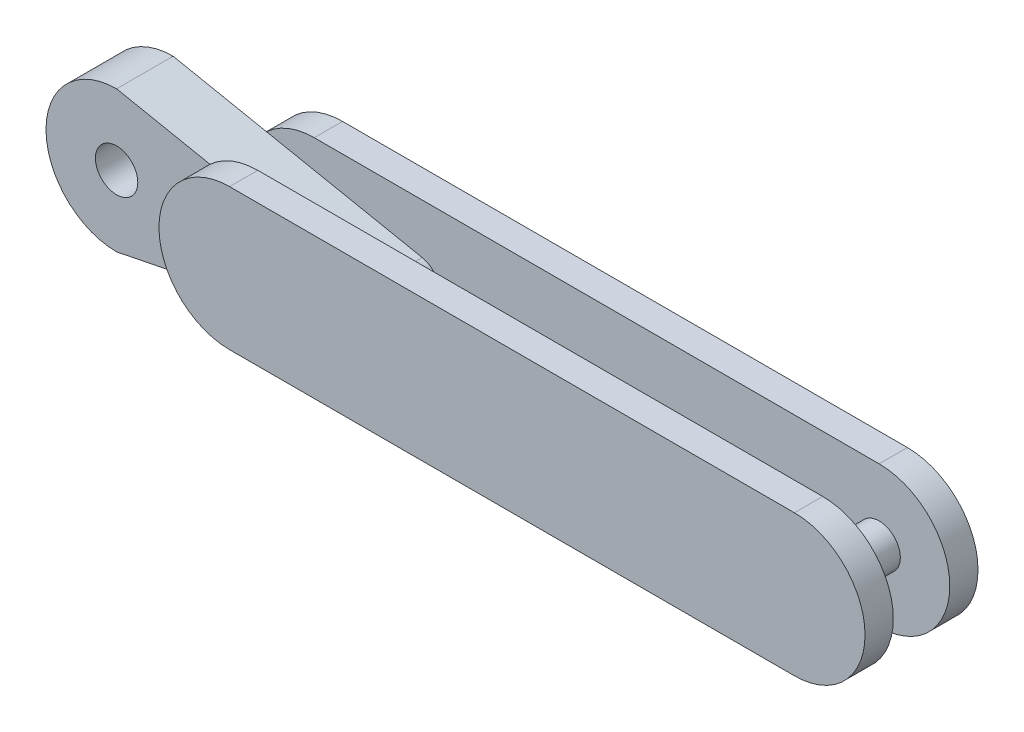
ISO-10303-21;
HEADER;
FILE_DESCRIPTION(('STEP AP214'),'2;1');
FILE_NAME('part.step','',(''),(''),'','','');
FILE_SCHEMA(('AUTOMOTIVE_DESIGN { 1 0 10303 214 1 1 1 1 }'));
ENDSEC;
DATA;
#1=APPLICATION_CONTEXT('core data for automotive mechanical design processes');
#2=APPLICATION_PROTOCOL_DEFINITION('international standard','automotive_design',2000,#1);
#3=PRODUCT_CONTEXT('',#1,'mechanical');
#4=PRODUCT('Part','Part','',(#3));
#5=PRODUCT_RELATED_PRODUCT_CATEGORY('part','',(#4));
#6=PRODUCT_DEFINITION_FORMATION('','',#4);
#7=PRODUCT_DEFINITION_CONTEXT('part definition',#1,'design');
#8=PRODUCT_DEFINITION('design','',#6,#7);
#9=PRODUCT_DEFINITION_SHAPE('','',#8);
#10=(LENGTH_UNIT() NAMED_UNIT(*) SI_UNIT(.MILLI.,.METRE.));
#11=(NAMED_UNIT(*) PLANE_ANGLE_UNIT() SI_UNIT($,.RADIAN.));
#12=(NAMED_UNIT(*) SI_UNIT($,.STERADIAN.) SOLID_ANGLE_UNIT());
#13=UNCERTAINTY_MEASURE_WITH_UNIT(LENGTH_MEASURE(1.E-05),#10,'distance_accuracy_value','');
#14=(GEOMETRIC_REPRESENTATION_CONTEXT(3) GLOBAL_UNCERTAINTY_ASSIGNED_CONTEXT((#13)) GLOBAL_UNIT_ASSIGNED_CONTEXT((#10,
#11,#12)) REPRESENTATION_CONTEXT('',''));
#15=CARTESIAN_POINT('',(0.,0.,0.));
#16=DIRECTION('',(0.,0.,1.));
#17=DIRECTION('',(1.,0.,0.));
#18=AXIS2_PLACEMENT_3D('',#15,#16,#17);
#19=CARTESIAN_POINT('',(0.,-50.,40.));
#20=DIRECTION('',(0.,1.,0.));
#21=DIRECTION('',(-1.,0.,0.));
#22=AXIS2_PLACEMENT_3D('',#19,#20,#21);
#23=PLANE('',#22);
#24=DIRECTION('',(1.,0.,0.));
#25=VECTOR('',#24,1.);
#26=CARTESIAN_POINT('',(500.,-50.,-20.));
#27=LINE('',#26,#25);
#28=CARTESIAN_POINT('',(100.,-50.,-20.));
#29=VERTEX_POINT('',#28);
#30=CARTESIAN_POINT('',(500.,-50.,-20.));
#31=VERTEX_POINT('',#30);
#32=EDGE_CURVE('E144',#29,#31,#27,.T.);
#33=ORIENTED_EDGE('',*,*,#32,.F.);
#34=DIRECTION('',(0.,0.,-1.));
#35=VECTOR('',#34,1.);
#36=CARTESIAN_POINT('',(100.,-50.,-20.));
#37=LINE('',#36,#35);
#38=CARTESIAN_POINT('',(100.,-50.,-40.));
#39=VERTEX_POINT('',#38);
#40=EDGE_CURVE('E197',#29,#39,#37,.T.);
#41=ORIENTED_EDGE('',*,*,#40,.T.);
#42=DIRECTION('',(1.,0.,0.));
#43=VECTOR('',#42,1.);
#44=CARTESIAN_POINT('',(0.,-50.,-40.));
#45=LINE('',#44,#43);
#46=CARTESIAN_POINT('',(500.,-50.,-40.));
#47=VERTEX_POINT('',#46);
#48=EDGE_CURVE('E227',#39,#47,#45,.T.);
#49=ORIENTED_EDGE('',*,*,#48,.T.);
#50=DIRECTION('',(0.,0.,-1.));
#51=VECTOR('',#50,1.);
#52=CARTESIAN_POINT('',(500.,-50.,40.));
#53=LINE('',#52,#51);
#54=EDGE_CURVE('E164',#31,#47,#53,.T.);
#55=ORIENTED_EDGE('',*,*,#54,.F.);
#56=EDGE_LOOP('',(#33,#41,#49,#55));
#57=FACE_BOUND('',#56,.T.);
#58=ADVANCED_FACE('F38',(#57),#23,.F.);
#59=CARTESIAN_POINT('',(0.,50.,40.));
#60=DIRECTION('',(0.,-1.,0.));
#61=DIRECTION('',(1.,0.,0.));
#62=AXIS2_PLACEMENT_3D('',#59,#60,#61);
#63=PLANE('',#62);
#64=DIRECTION('',(-1.,0.,0.));
#65=VECTOR('',#64,1.);
#66=CARTESIAN_POINT('',(0.,50.,-20.));
#67=LINE('',#66,#65);
#68=CARTESIAN_POINT('',(500.,50.0000000000001,-20.));
#69=VERTEX_POINT('',#68);
#70=CARTESIAN_POINT('',(100.,50.,-20.));
#71=VERTEX_POINT('',#70);
#72=EDGE_CURVE('E142',#69,#71,#67,.T.);
#73=ORIENTED_EDGE('',*,*,#72,.F.);
#74=DIRECTION('',(0.,0.,-1.));
#75=VECTOR('',#74,1.);
#76=CARTESIAN_POINT('',(500.,50.0000000000001,40.));
#77=LINE('',#76,#75);
#78=CARTESIAN_POINT('',(500.,50.0000000000001,-40.));
#79=VERTEX_POINT('',#78);
#80=EDGE_CURVE('E153',#69,#79,#77,.T.);
#81=ORIENTED_EDGE('',*,*,#80,.T.);
#82=DIRECTION('',(-1.,0.,0.));
#83=VECTOR('',#82,1.);
#84=CARTESIAN_POINT('',(0.,50.,-40.));
#85=LINE('',#84,#83);
#86=CARTESIAN_POINT('',(100.,50.,-40.));
#87=VERTEX_POINT('',#86);
#88=EDGE_CURVE('E233',#79,#87,#85,.T.);
#89=ORIENTED_EDGE('',*,*,#88,.T.);
#90=DIRECTION('',(0.,0.,-1.));
#91=VECTOR('',#90,1.);
#92=CARTESIAN_POINT('',(100.,50.,-20.));
#93=LINE('',#92,#91);
#94=EDGE_CURVE('E61',#71,#87,#93,.T.);
#95=ORIENTED_EDGE('',*,*,#94,.F.);
#96=EDGE_LOOP('',(#73,#81,#89,#95));
#97=FACE_BOUND('',#96,.T.);
#98=ADVANCED_FACE('F151',(#97),#63,.F.);
#99=CARTESIAN_POINT('',(500.,0.,40.));
#100=DIRECTION('',(0.,0.,-1.));
#101=DIRECTION('',(-1.,0.,0.));
#102=AXIS2_PLACEMENT_3D('',#99,#100,#101);
#103=CYLINDRICAL_SURFACE('',#102,50.);
#104=CARTESIAN_POINT('',(500.,0.,-20.));
#105=DIRECTION('',(0.,0.,1.));
#106=DIRECTION('',(1.,0.,0.));
#107=AXIS2_PLACEMENT_3D('',#104,#105,#106);
#108=CIRCLE('',#107,50.);
#109=EDGE_CURVE('E139',#31,#69,#108,.T.);
#110=ORIENTED_EDGE('',*,*,#109,.F.);
#111=ORIENTED_EDGE('',*,*,#54,.T.);
#112=CARTESIAN_POINT('',(500.,0.,-40.));
#113=DIRECTION('',(0.,0.,1.));
#114=DIRECTION('',(1.,0.,0.));
#115=AXIS2_PLACEMENT_3D('',#112,#113,#114);
#116=CIRCLE('',#115,50.);
#117=EDGE_CURVE('E158',#47,#79,#116,.T.);
#118=ORIENTED_EDGE('',*,*,#117,.T.);
#119=ORIENTED_EDGE('',*,*,#80,.F.);
#120=EDGE_LOOP('',(#110,#111,#118,#119));
#121=FACE_BOUND('',#120,.T.);
#122=ADVANCED_FACE('F156',(#121),#103,.T.);
#123=CARTESIAN_POINT('',(0.,0.,40.));
#124=DIRECTION('',(0.,0.,-1.));
#125=DIRECTION('',(-1.,0.,0.));
#126=AXIS2_PLACEMENT_3D('',#123,#124,#125);
#127=CYLINDRICAL_SURFACE('',#126,50.);
#128=CARTESIAN_POINT('',(0.,0.,-20.));
#129=DIRECTION('',(0.,0.,-1.));
#130=DIRECTION('',(-1.,0.,0.));
#131=AXIS2_PLACEMENT_3D('',#128,#129,#130);
#132=CIRCLE('',#131,50.);
#133=CARTESIAN_POINT('',(5.27355936696949E-13,-50.,-20.));
#134=VERTEX_POINT('',#133);
#135=CARTESIAN_POINT('',(0.,50.,-20.));
#136=VERTEX_POINT('',#135);
#137=EDGE_CURVE('E205',#134,#136,#132,.T.);
#138=ORIENTED_EDGE('',*,*,#137,.F.);
#139=DIRECTION('',(0.,0.,-1.));
#140=VECTOR('',#139,1.);
#141=CARTESIAN_POINT('',(0.,-50.,40.));
#142=LINE('',#141,#140);
#143=CARTESIAN_POINT('',(5.27355936696949E-13,-50.,20.));
#144=VERTEX_POINT('',#143);
#145=EDGE_CURVE('E173',#144,#134,#142,.T.);
#146=ORIENTED_EDGE('',*,*,#145,.F.);
#147=CARTESIAN_POINT('',(0.,0.,20.));
#148=DIRECTION('',(0.,0.,1.));
#149=DIRECTION('',(1.,0.,0.));
#150=AXIS2_PLACEMENT_3D('',#147,#148,#149);
#151=CIRCLE('',#150,50.);
#152=CARTESIAN_POINT('',(0.,50.,20.));
#153=VERTEX_POINT('',#152);
#154=EDGE_CURVE('E218',#153,#144,#151,.T.);
#155=ORIENTED_EDGE('',*,*,#154,.F.);
#156=DIRECTION('',(0.,0.,-1.));
#157=VECTOR('',#156,1.);
#158=CARTESIAN_POINT('',(0.,50.,40.));
#159=LINE('',#158,#157);
#160=EDGE_CURVE('E161',#153,#136,#159,.T.);
#161=ORIENTED_EDGE('',*,*,#160,.T.);
#162=EDGE_LOOP('',(#138,#146,#155,#161));
#163=FACE_BOUND('',#162,.T.);
#164=ADVANCED_FACE('F40',(#163),#127,.T.);
#165=DIRECTION('',(0.,0.,1.));
#166=VECTOR('',#165,1.);
#167=CARTESIAN_POINT('',(100.,-50.,20.));
#168=LINE('',#167,#166);
#169=CARTESIAN_POINT('',(100.,-50.,20.));
#170=VERTEX_POINT('',#169);
#171=CARTESIAN_POINT('',(100.,-50.,40.));
#172=VERTEX_POINT('',#171);
#173=EDGE_CURVE('E225',#170,#172,#168,.T.);
#174=ORIENTED_EDGE('',*,*,#173,.F.);
#175=DIRECTION('',(1.,0.,0.));
#176=VECTOR('',#175,1.);
#177=CARTESIAN_POINT('',(500.,-50.,20.));
#178=LINE('',#177,#176);
#179=CARTESIAN_POINT('',(500.,-50.,20.));
#180=VERTEX_POINT('',#179);
#181=EDGE_CURVE('E148',#170,#180,#178,.T.);
#182=ORIENTED_EDGE('',*,*,#181,.T.);
#183=CARTESIAN_POINT('',(500.,-50.,40.));
#184=VERTEX_POINT('',#183);
#185=EDGE_CURVE('E170',#184,#180,#53,.T.);
#186=ORIENTED_EDGE('',*,*,#185,.F.);
#187=DIRECTION('',(1.,0.,0.));
#188=VECTOR('',#187,1.);
#189=CARTESIAN_POINT('',(0.,-50.,40.));
#190=LINE('',#189,#188);
#191=EDGE_CURVE('E230',#172,#184,#190,.T.);
#192=ORIENTED_EDGE('',*,*,#191,.F.);
#193=EDGE_LOOP('',(#174,#182,#186,#192));
#194=FACE_BOUND('',#193,.T.);
#195=ADVANCED_FACE('F290',(#194),#23,.F.);
#196=CARTESIAN_POINT('',(500.,50.0000000000001,40.));
#197=VERTEX_POINT('',#196);
#198=CARTESIAN_POINT('',(500.,50.0000000000001,20.));
#199=VERTEX_POINT('',#198);
#200=EDGE_CURVE('E160',#197,#199,#77,.T.);
#201=ORIENTED_EDGE('',*,*,#200,.T.);
#202=DIRECTION('',(-1.,0.,0.));
#203=VECTOR('',#202,1.);
#204=CARTESIAN_POINT('',(0.,50.,20.));
#205=LINE('',#204,#203);
#206=CARTESIAN_POINT('',(100.,50.,20.));
#207=VERTEX_POINT('',#206);
#208=EDGE_CURVE('E253',#199,#207,#205,.T.);
#209=ORIENTED_EDGE('',*,*,#208,.T.);
#210=DIRECTION('',(0.,0.,1.));
#211=VECTOR('',#210,1.);
#212=CARTESIAN_POINT('',(100.,50.,20.));
#213=LINE('',#212,#211);
#214=CARTESIAN_POINT('',(100.,50.,40.));
#215=VERTEX_POINT('',#214);
#216=EDGE_CURVE('E223',#207,#215,#213,.T.);
#217=ORIENTED_EDGE('',*,*,#216,.T.);
#218=DIRECTION('',(-1.,0.,0.));
#219=VECTOR('',#218,1.);
#220=CARTESIAN_POINT('',(0.,50.,40.));
#221=LINE('',#220,#219);
#222=EDGE_CURVE('E166',#197,#215,#221,.T.);
#223=ORIENTED_EDGE('',*,*,#222,.F.);
#224=EDGE_LOOP('',(#201,#209,#217,#223));
#225=FACE_BOUND('',#224,.T.);
#226=ADVANCED_FACE('F295',(#225),#63,.F.);
#227=ORIENTED_EDGE('',*,*,#185,.T.);
#228=CARTESIAN_POINT('',(500.,0.,20.));
#229=DIRECTION('',(0.,0.,1.));
#230=DIRECTION('',(1.,0.,0.));
#231=AXIS2_PLACEMENT_3D('',#228,#229,#230);
#232=CIRCLE('',#231,50.);
#233=EDGE_CURVE('E250',#180,#199,#232,.T.);
#234=ORIENTED_EDGE('',*,*,#233,.T.);
#235=ORIENTED_EDGE('',*,*,#200,.F.);
#236=CARTESIAN_POINT('',(500.,0.,40.));
#237=DIRECTION('',(0.,0.,1.));
#238=DIRECTION('',(1.,0.,0.));
#239=AXIS2_PLACEMENT_3D('',#236,#237,#238);
#240=CIRCLE('',#239,50.);
#241=EDGE_CURVE('E232',#184,#197,#240,.T.);
#242=ORIENTED_EDGE('',*,*,#241,.F.);
#243=EDGE_LOOP('',(#227,#234,#235,#242));
#244=FACE_BOUND('',#243,.T.);
#245=ADVANCED_FACE('F303',(#244),#103,.T.);
#246=CARTESIAN_POINT('',(0.,0.,40.));
#247=DIRECTION('',(0.,0.,1.));
#248=DIRECTION('',(1.,0.,0.));
#249=AXIS2_PLACEMENT_3D('',#246,#247,#248);
#250=PLANE('',#249);
#251=CARTESIAN_POINT('',(100.,0.,40.));
#252=DIRECTION('',(0.,0.,-1.));
#253=DIRECTION('',(1.,0.,0.));
#254=AXIS2_PLACEMENT_3D('',#251,#252,#253);
#255=CIRCLE('',#254,50.);
#256=EDGE_CURVE('E214',#172,#215,#255,.T.);
#257=ORIENTED_EDGE('',*,*,#256,.F.);
#258=ORIENTED_EDGE('',*,*,#191,.T.);
#259=ORIENTED_EDGE('',*,*,#241,.T.);
#260=ORIENTED_EDGE('',*,*,#222,.T.);
#261=EDGE_LOOP('',(#257,#258,#259,#260));
#262=FACE_BOUND('',#261,.T.);
#263=ADVANCED_FACE('F314',(#262),#250,.T.);
#264=CARTESIAN_POINT('',(0.,0.,-40.));
#265=DIRECTION('',(0.,0.,1.));
#266=DIRECTION('',(1.,0.,0.));
#267=AXIS2_PLACEMENT_3D('',#264,#265,#266);
#268=PLANE('',#267);
#269=ORIENTED_EDGE('',*,*,#48,.F.);
#270=CARTESIAN_POINT('',(100.,0.,-40.));
#271=DIRECTION('',(0.,0.,1.));
#272=DIRECTION('',(-1.,0.,0.));
#273=AXIS2_PLACEMENT_3D('',#270,#271,#272);
#274=CIRCLE('',#273,50.);
#275=EDGE_CURVE('E198',#87,#39,#274,.T.);
#276=ORIENTED_EDGE('',*,*,#275,.F.);
#277=ORIENTED_EDGE('',*,*,#88,.F.);
#278=ORIENTED_EDGE('',*,*,#117,.F.);
#279=EDGE_LOOP('',(#269,#276,#277,#278));
#280=FACE_BOUND('',#279,.T.);
#281=ADVANCED_FACE('F241',(#280),#268,.F.);
#282=CARTESIAN_POINT('',(100.,0.,20.));
#283=DIRECTION('',(0.,0.,1.));
#284=DIRECTION('',(1.,0.,0.));
#285=AXIS2_PLACEMENT_3D('',#282,#283,#284);
#286=CYLINDRICAL_SURFACE('',#285,50.);
#287=ORIENTED_EDGE('',*,*,#256,.T.);
#288=ORIENTED_EDGE('',*,*,#216,.F.);
#289=CARTESIAN_POINT('',(100.,0.,20.));
#290=DIRECTION('',(0.,0.,-1.));
#291=DIRECTION('',(1.,0.,0.));
#292=AXIS2_PLACEMENT_3D('',#289,#290,#291);
#293=CIRCLE('',#292,50.);
#294=CARTESIAN_POINT('',(66.1239843690609,36.7752031261878,20.));
#295=VERTEX_POINT('',#294);
#296=EDGE_CURVE('E220',#295,#207,#293,.T.);
#297=ORIENTED_EDGE('',*,*,#296,.F.);
#298=CARTESIAN_POINT('',(66.123984369061,-36.7752031261879,20.));
#299=VERTEX_POINT('',#298);
#300=EDGE_CURVE('E219',#299,#295,#293,.T.);
#301=ORIENTED_EDGE('',*,*,#300,.F.);
#302=EDGE_CURVE('E216',#170,#299,#293,.T.);
#303=ORIENTED_EDGE('',*,*,#302,.F.);
#304=ORIENTED_EDGE('',*,*,#173,.T.);
#305=EDGE_LOOP('',(#287,#288,#297,#301,#303,#304));
#306=FACE_BOUND('',#305,.T.);
#307=ADVANCED_FACE('F278',(#306),#286,.T.);
#308=CARTESIAN_POINT('',(100.,0.,20.));
#309=DIRECTION('',(0.,0.,1.));
#310=DIRECTION('',(1.,0.,0.));
#311=AXIS2_PLACEMENT_3D('',#308,#309,#310);
#312=PLANE('',#311);
#313=DIRECTION('',(-0.98058067569092,-0.196116135138184,0.));
#314=VECTOR('',#313,1.);
#315=CARTESIAN_POINT('',(176.456449323181,-14.7087101353638,20.));
#316=LINE('',#315,#314);
#317=EDGE_CURVE('E264',#299,#144,#316,.T.);
#318=ORIENTED_EDGE('',*,*,#317,.F.);
#319=ORIENTED_EDGE('',*,*,#300,.T.);
#320=DIRECTION('',(0.98058067569092,-0.196116135138184,0.));
#321=VECTOR('',#320,1.);
#322=CARTESIAN_POINT('',(0.,50.,20.));
#323=LINE('',#322,#321);
#324=EDGE_CURVE('E258',#153,#295,#323,.T.);
#325=ORIENTED_EDGE('',*,*,#324,.F.);
#326=ORIENTED_EDGE('',*,*,#154,.T.);
#327=EDGE_LOOP('',(#318,#319,#325,#326));
#328=FACE_BOUND('',#327,.T.);
#329=CARTESIAN_POINT('',(0.,0.,20.));
#330=DIRECTION('',(0.,0.,1.));
#331=DIRECTION('',(1.,0.,0.));
#332=AXIS2_PLACEMENT_3D('',#329,#330,#331);
#333=CIRCLE('',#332,15.);
#334=CARTESIAN_POINT('',(15.,0.,20.));
#335=VERTEX_POINT('',#334);
#336=EDGE_CURVE('E208',#335,#335,#333,.T.);
#337=ORIENTED_EDGE('',*,*,#336,.F.);
#338=EDGE_LOOP('',(#337));
#339=FACE_BOUND('',#338,.T.);
#340=ADVANCED_FACE('F276',(#328,#339),#312,.T.);
#341=CARTESIAN_POINT('',(100.,0.,-20.));
#342=DIRECTION('',(0.,0.,-1.));
#343=DIRECTION('',(-1.,0.,0.));
#344=AXIS2_PLACEMENT_3D('',#341,#342,#343);
#345=CYLINDRICAL_SURFACE('',#344,50.);
#346=ORIENTED_EDGE('',*,*,#275,.T.);
#347=ORIENTED_EDGE('',*,*,#40,.F.);
#348=CARTESIAN_POINT('',(100.,0.,-20.));
#349=DIRECTION('',(0.,0.,1.));
#350=DIRECTION('',(-1.,0.,0.));
#351=AXIS2_PLACEMENT_3D('',#348,#349,#350);
#352=CIRCLE('',#351,50.);
#353=CARTESIAN_POINT('',(66.123984369061,-36.7752031261879,-20.));
#354=VERTEX_POINT('',#353);
#355=EDGE_CURVE('E188',#354,#29,#352,.T.);
#356=ORIENTED_EDGE('',*,*,#355,.F.);
#357=CARTESIAN_POINT('',(66.123984369061,36.7752031261878,-20.));
#358=VERTEX_POINT('',#357);
#359=EDGE_CURVE('E195',#358,#354,#352,.T.);
#360=ORIENTED_EDGE('',*,*,#359,.F.);
#361=EDGE_CURVE('E200',#71,#358,#352,.T.);
#362=ORIENTED_EDGE('',*,*,#361,.F.);
#363=ORIENTED_EDGE('',*,*,#94,.T.);
#364=EDGE_LOOP('',(#346,#347,#356,#360,#362,#363));
#365=FACE_BOUND('',#364,.T.);
#366=ADVANCED_FACE('F194',(#365),#345,.T.);
#367=CARTESIAN_POINT('',(100.,0.,-20.));
#368=DIRECTION('',(0.,0.,-1.));
#369=DIRECTION('',(-1.,0.,0.));
#370=AXIS2_PLACEMENT_3D('',#367,#368,#369);
#371=PLANE('',#370);
#372=DIRECTION('',(0.98058067569092,0.196116135138184,0.));
#373=VECTOR('',#372,1.);
#374=CARTESIAN_POINT('',(105.769230769231,-28.8461538461539,-20.));
#375=LINE('',#374,#373);
#376=EDGE_CURVE('E46',#134,#354,#375,.T.);
#377=ORIENTED_EDGE('',*,*,#376,.F.);
#378=ORIENTED_EDGE('',*,*,#137,.T.);
#379=DIRECTION('',(0.98058067569092,-0.196116135138184,0.));
#380=VECTOR('',#379,1.);
#381=CARTESIAN_POINT('',(0.,50.,-20.));
#382=LINE('',#381,#380);
#383=EDGE_CURVE('E204',#136,#358,#382,.T.);
#384=ORIENTED_EDGE('',*,*,#383,.T.);
#385=ORIENTED_EDGE('',*,*,#359,.T.);
#386=EDGE_LOOP('',(#377,#378,#384,#385));
#387=FACE_BOUND('',#386,.T.);
#388=CARTESIAN_POINT('',(0.,0.,-20.));
#389=DIRECTION('',(0.,0.,1.));
#390=DIRECTION('',(1.,0.,0.));
#391=AXIS2_PLACEMENT_3D('',#388,#389,#390);
#392=CIRCLE('',#391,15.);
#393=CARTESIAN_POINT('',(15.,0.,-20.));
#394=VERTEX_POINT('',#393);
#395=EDGE_CURVE('E212',#394,#394,#392,.T.);
#396=ORIENTED_EDGE('',*,*,#395,.T.);
#397=EDGE_LOOP('',(#396));
#398=FACE_BOUND('',#397,.T.);
#399=ADVANCED_FACE('F202',(#387,#398),#371,.T.);
#400=CARTESIAN_POINT('',(0.,0.,-20.));
#401=DIRECTION('',(0.,0.,1.));
#402=DIRECTION('',(1.,0.,0.));
#403=AXIS2_PLACEMENT_3D('',#400,#401,#402);
#404=CYLINDRICAL_SURFACE('',#403,15.);
#405=ORIENTED_EDGE('',*,*,#395,.F.);
#406=EDGE_LOOP('',(#405));
#407=FACE_BOUND('',#406,.T.);
#408=ORIENTED_EDGE('',*,*,#336,.T.);
#409=EDGE_LOOP('',(#408));
#410=FACE_BOUND('',#409,.T.);
#411=ADVANCED_FACE('F274',(#407,#410),#404,.F.);
#412=CARTESIAN_POINT('',(500.,0.,20.));
#413=DIRECTION('',(0.,0.,1.));
#414=DIRECTION('',(1.,0.,0.));
#415=AXIS2_PLACEMENT_3D('',#412,#413,#414);
#416=PLANE('',#415);
#417=CARTESIAN_POINT('',(500.,0.,20.));
#418=DIRECTION('',(0.,0.,1.));
#419=DIRECTION('',(1.,0.,0.));
#420=AXIS2_PLACEMENT_3D('',#417,#418,#419);
#421=CIRCLE('',#420,15.);
#422=CARTESIAN_POINT('',(515.,0.,20.));
#423=VERTEX_POINT('',#422);
#424=EDGE_CURVE('E254',#423,#423,#421,.T.);
#425=ORIENTED_EDGE('',*,*,#424,.T.);
#426=EDGE_LOOP('',(#425));
#427=FACE_BOUND('',#426,.T.);
#428=ORIENTED_EDGE('',*,*,#208,.F.);
#429=ORIENTED_EDGE('',*,*,#233,.F.);
#430=ORIENTED_EDGE('',*,*,#181,.F.);
#431=ORIENTED_EDGE('',*,*,#302,.T.);
#432=CARTESIAN_POINT('',(176.456449323181,-14.7087101353638,20.));
#433=VERTEX_POINT('',#432);
#434=EDGE_CURVE('E265',#433,#299,#316,.T.);
#435=ORIENTED_EDGE('',*,*,#434,.F.);
#436=CARTESIAN_POINT('',(173.514707296108,0.,20.));
#437=DIRECTION('',(0.,0.,-1.));
#438=DIRECTION('',(1.,0.,0.));
#439=AXIS2_PLACEMENT_3D('',#436,#437,#438);
#440=CIRCLE('',#439,15.);
#441=CARTESIAN_POINT('',(176.456449323181,14.7087101353638,20.));
#442=VERTEX_POINT('',#441);
#443=EDGE_CURVE('E261',#442,#433,#440,.T.);
#444=ORIENTED_EDGE('',*,*,#443,.F.);
#445=EDGE_CURVE('E257',#295,#442,#323,.T.);
#446=ORIENTED_EDGE('',*,*,#445,.F.);
#447=ORIENTED_EDGE('',*,*,#296,.T.);
#448=EDGE_LOOP('',(#428,#429,#430,#431,#435,#444,#446,#447));
#449=FACE_BOUND('',#448,.T.);
#450=ADVANCED_FACE('F325',(#427,#449),#416,.F.);
#451=CARTESIAN_POINT('',(500.,0.,-20.));
#452=DIRECTION('',(0.,0.,1.));
#453=DIRECTION('',(1.,0.,0.));
#454=AXIS2_PLACEMENT_3D('',#451,#452,#453);
#455=PLANE('',#454);
#456=CARTESIAN_POINT('',(500.,0.,-20.));
#457=DIRECTION('',(0.,0.,1.));
#458=DIRECTION('',(1.,0.,0.));
#459=AXIS2_PLACEMENT_3D('',#456,#457,#458);
#460=CIRCLE('',#459,15.);
#461=CARTESIAN_POINT('',(515.,0.,-20.));
#462=VERTEX_POINT('',#461);
#463=EDGE_CURVE('E11',#462,#462,#460,.T.);
#464=ORIENTED_EDGE('',*,*,#463,.F.);
#465=EDGE_LOOP('',(#464));
#466=FACE_BOUND('',#465,.T.);
#467=ORIENTED_EDGE('',*,*,#361,.T.);
#468=CARTESIAN_POINT('',(176.456449323181,14.7087101353638,-20.));
#469=VERTEX_POINT('',#468);
#470=EDGE_CURVE('E53',#358,#469,#382,.T.);
#471=ORIENTED_EDGE('',*,*,#470,.T.);
#472=CARTESIAN_POINT('',(173.514707296108,0.,-20.));
#473=DIRECTION('',(0.,0.,-1.));
#474=DIRECTION('',(1.,0.,0.));
#475=AXIS2_PLACEMENT_3D('',#472,#473,#474);
#476=CIRCLE('',#475,15.);
#477=CARTESIAN_POINT('',(176.456449323181,-14.7087101353638,-20.));
#478=VERTEX_POINT('',#477);
#479=EDGE_CURVE('E190',#469,#478,#476,.T.);
#480=ORIENTED_EDGE('',*,*,#479,.T.);
#481=DIRECTION('',(-0.98058067569092,-0.196116135138184,0.));
#482=VECTOR('',#481,1.);
#483=CARTESIAN_POINT('',(176.456449323181,-14.7087101353638,-20.));
#484=LINE('',#483,#482);
#485=EDGE_CURVE('E180',#478,#354,#484,.T.);
#486=ORIENTED_EDGE('',*,*,#485,.T.);
#487=ORIENTED_EDGE('',*,*,#355,.T.);
#488=ORIENTED_EDGE('',*,*,#32,.T.);
#489=ORIENTED_EDGE('',*,*,#109,.T.);
#490=ORIENTED_EDGE('',*,*,#72,.T.);
#491=EDGE_LOOP('',(#467,#471,#480,#486,#487,#488,#489,#490));
#492=FACE_BOUND('',#491,.T.);
#493=ADVANCED_FACE('F141',(#466,#492),#455,.T.);
#494=CARTESIAN_POINT('',(176.456449323181,-14.7087101353638,-20.));
#495=DIRECTION('',(-0.196116135138184,0.98058067569092,0.));
#496=DIRECTION('',(-0.98058067569092,-0.196116135138184,0.));
#497=AXIS2_PLACEMENT_3D('',#494,#495,#496);
#498=PLANE('',#497);
#499=ORIENTED_EDGE('',*,*,#434,.T.);
#500=ORIENTED_EDGE('',*,*,#317,.T.);
#501=ORIENTED_EDGE('',*,*,#145,.T.);
#502=ORIENTED_EDGE('',*,*,#376,.T.);
#503=ORIENTED_EDGE('',*,*,#485,.F.);
#504=DIRECTION('',(0.,0.,1.));
#505=VECTOR('',#504,1.);
#506=CARTESIAN_POINT('',(176.456449323181,-14.7087101353638,-20.));
#507=LINE('',#506,#505);
#508=EDGE_CURVE('E246',#478,#433,#507,.T.);
#509=ORIENTED_EDGE('',*,*,#508,.T.);
#510=EDGE_LOOP('',(#499,#500,#501,#502,#503,#509));
#511=FACE_BOUND('',#510,.T.);
#512=ADVANCED_FACE('F179',(#511),#498,.F.);
#513=CARTESIAN_POINT('',(173.514707296108,0.,-20.));
#514=DIRECTION('',(0.,0.,1.));
#515=DIRECTION('',(1.,0.,0.));
#516=AXIS2_PLACEMENT_3D('',#513,#514,#515);
#517=CYLINDRICAL_SURFACE('',#516,15.);
#518=ORIENTED_EDGE('',*,*,#443,.T.);
#519=ORIENTED_EDGE('',*,*,#508,.F.);
#520=ORIENTED_EDGE('',*,*,#479,.F.);
#521=DIRECTION('',(0.,0.,1.));
#522=VECTOR('',#521,1.);
#523=CARTESIAN_POINT('',(176.456449323181,14.7087101353638,-20.));
#524=LINE('',#523,#522);
#525=EDGE_CURVE('E243',#469,#442,#524,.T.);
#526=ORIENTED_EDGE('',*,*,#525,.T.);
#527=EDGE_LOOP('',(#518,#519,#520,#526));
#528=FACE_BOUND('',#527,.T.);
#529=ADVANCED_FACE('F327',(#528),#517,.T.);
#530=CARTESIAN_POINT('',(0.,50.,-20.));
#531=DIRECTION('',(-0.196116135138184,-0.98058067569092,0.));
#532=DIRECTION('',(0.98058067569092,-0.196116135138184,0.));
#533=AXIS2_PLACEMENT_3D('',#530,#531,#532);
#534=PLANE('',#533);
#535=ORIENTED_EDGE('',*,*,#324,.T.);
#536=ORIENTED_EDGE('',*,*,#445,.T.);
#537=ORIENTED_EDGE('',*,*,#525,.F.);
#538=ORIENTED_EDGE('',*,*,#470,.F.);
#539=ORIENTED_EDGE('',*,*,#383,.F.);
#540=ORIENTED_EDGE('',*,*,#160,.F.);
#541=EDGE_LOOP('',(#535,#536,#537,#538,#539,#540));
#542=FACE_BOUND('',#541,.T.);
#543=ADVANCED_FACE('F328',(#542),#534,.F.);
#544=CARTESIAN_POINT('',(500.,0.,-62.4264068711929));
#545=DIRECTION('',(0.,0.,1.));
#546=DIRECTION('',(1.,0.,0.));
#547=AXIS2_PLACEMENT_3D('',#544,#545,#546);
#548=CYLINDRICAL_SURFACE('',#547,15.);
#549=CARTESIAN_POINT('',(515.,0.,-20.));
#550=CARTESIAN_POINT('',(515.,0.,-19.5833333333333));
#551=CARTESIAN_POINT('',(515.,0.,-19.1666666666667));
#552=CARTESIAN_POINT('',(515.,0.,-18.3333333333333));
#553=CARTESIAN_POINT('',(515.,0.,-17.9166666666667));
#554=CARTESIAN_POINT('',(515.,0.,-17.0833333333333));
#555=CARTESIAN_POINT('',(515.,0.,-16.6666666666667));
#556=CARTESIAN_POINT('',(515.,0.,-15.8333333333333));
#557=CARTESIAN_POINT('',(515.,0.,-15.4166666666667));
#558=CARTESIAN_POINT('',(515.,0.,-14.5833333333333));
#559=CARTESIAN_POINT('',(515.,0.,-14.1666666666667));
#560=CARTESIAN_POINT('',(515.,0.,-13.3333333333333));
#561=CARTESIAN_POINT('',(515.,0.,-12.9166666666667));
#562=CARTESIAN_POINT('',(515.,0.,-12.0833333333333));
#563=CARTESIAN_POINT('',(515.,0.,-11.6666666666667));
#564=CARTESIAN_POINT('',(515.,0.,-10.8333333333333));
#565=CARTESIAN_POINT('',(515.,0.,-10.4166666666667));
#566=CARTESIAN_POINT('',(515.,0.,-9.58333333333333));
#567=CARTESIAN_POINT('',(515.,0.,-9.16666666666667));
#568=CARTESIAN_POINT('',(515.,0.,-8.33333333333333));
#569=CARTESIAN_POINT('',(515.,0.,-7.91666666666667));
#570=CARTESIAN_POINT('',(515.,0.,-7.08333333333333));
#571=CARTESIAN_POINT('',(515.,0.,-6.66666666666667));
#572=CARTESIAN_POINT('',(515.,0.,-5.83333333333334));
#573=CARTESIAN_POINT('',(515.,0.,-5.41666666666667));
#574=CARTESIAN_POINT('',(515.,0.,-4.58333333333334));
#575=CARTESIAN_POINT('',(515.,0.,-4.16666666666667));
#576=CARTESIAN_POINT('',(515.,0.,-3.33333333333334));
#577=CARTESIAN_POINT('',(515.,0.,-2.91666666666667));
#578=CARTESIAN_POINT('',(515.,0.,-2.08333333333334));
#579=CARTESIAN_POINT('',(515.,0.,-1.66666666666667));
#580=CARTESIAN_POINT('',(515.,0.,-0.833333333333334));
#581=CARTESIAN_POINT('',(515.,0.,-0.416666666666667));
#582=CARTESIAN_POINT('',(515.,0.,0.416666666666665));
#583=CARTESIAN_POINT('',(515.,0.,0.833333333333329));
#584=CARTESIAN_POINT('',(515.,0.,1.66666666666666));
#585=CARTESIAN_POINT('',(515.,0.,2.08333333333333));
#586=CARTESIAN_POINT('',(515.,0.,2.91666666666666));
#587=CARTESIAN_POINT('',(515.,0.,3.33333333333333));
#588=CARTESIAN_POINT('',(515.,0.,4.16666666666666));
#589=CARTESIAN_POINT('',(515.,0.,4.58333333333333));
#590=CARTESIAN_POINT('',(515.,0.,5.41666666666666));
#591=CARTESIAN_POINT('',(515.,0.,5.83333333333333));
#592=CARTESIAN_POINT('',(515.,0.,6.66666666666666));
#593=CARTESIAN_POINT('',(515.,0.,7.08333333333332));
#594=CARTESIAN_POINT('',(515.,0.,7.91666666666665));
#595=CARTESIAN_POINT('',(515.,0.,8.33333333333332));
#596=CARTESIAN_POINT('',(515.,0.,9.16666666666666));
#597=CARTESIAN_POINT('',(515.,0.,9.58333333333332));
#598=CARTESIAN_POINT('',(515.,0.,10.4166666666667));
#599=CARTESIAN_POINT('',(515.,0.,10.8333333333333));
#600=CARTESIAN_POINT('',(515.,0.,11.6666666666667));
#601=CARTESIAN_POINT('',(515.,0.,12.0833333333333));
#602=CARTESIAN_POINT('',(515.,0.,12.9166666666667));
#603=CARTESIAN_POINT('',(515.,0.,13.3333333333333));
#604=CARTESIAN_POINT('',(515.,0.,14.1666666666667));
#605=CARTESIAN_POINT('',(515.,0.,14.5833333333333));
#606=CARTESIAN_POINT('',(515.,0.,15.4166666666667));
#607=CARTESIAN_POINT('',(515.,0.,15.8333333333333));
#608=CARTESIAN_POINT('',(515.,0.,16.6666666666667));
#609=CARTESIAN_POINT('',(515.,0.,17.0833333333333));
#610=CARTESIAN_POINT('',(515.,0.,17.9166666666667));
#611=CARTESIAN_POINT('',(515.,0.,18.3333333333333));
#612=CARTESIAN_POINT('',(515.,0.,19.1666666666667));
#613=CARTESIAN_POINT('',(515.,0.,19.5833333333333));
#614=CARTESIAN_POINT('',(515.,0.,20.));
#615=B_SPLINE_CURVE_WITH_KNOTS('',3,(#549,#550,#551,#552,#553,#554,#555,#556,#557,#558,#559,
#560,#561,#562,#563,#564,#565,#566,#567,#568,#569,#570,#571,#572,#573,#574,#575,#576,#577,#578,
#579,#580,#581,#582,#583,#584,#585,#586,#587,#588,#589,#590,#591,#592,#593,#594,#595,#596,#597,
#598,#599,#600,#601,#602,#603,#604,#605,#606,#607,#608,#609,#610,#611,#612,#613,#614),
.UNSPECIFIED.,.F.,.F.,(4,2,2,2,2,2,2,2,2,2,2,2,2,2,2,2,2,2,2,2,2,2,2,2,2,2,2,2,2,2,2,2,4),(0.,
1.25,2.5,3.75,5.,6.25,7.5,8.75,10.,11.25,12.5,13.75,15.,16.25,17.5,18.75,20.,21.25,22.5,23.75,
25.,26.25,27.5,28.75,30.,31.25,32.5,33.75,35.,36.25,37.5,38.75,40.),.UNSPECIFIED.);
#616=EDGE_CURVE('BSEAM335',#462,#423,#615,.T.);
#617=ORIENTED_EDGE('',*,*,#463,.T.);
#618=ORIENTED_EDGE('',*,*,#424,.F.);
#619=ORIENTED_EDGE('',*,*,#616,.T.);
#620=ORIENTED_EDGE('',*,*,#616,.F.);
#621=EDGE_LOOP('',(#617,#619,#618,#620));
#622=FACE_BOUND('',#621,.T.);
#623=ADVANCED_FACE('F335',(#622),#548,.T.);
#624=CLOSED_SHELL('',(#58,#98,#122,#164,#195,#226,#245,#263,#281,#307,#340,#366,#399,#411,#450,
#493,#512,#529,#543,#623));
#625=MANIFOLD_SOLID_BREP('B2',#624);
#626=ADVANCED_BREP_SHAPE_REPRESENTATION('',(#18,#625),#14);
#627=SHAPE_DEFINITION_REPRESENTATION(#9,#626);
ENDSEC;
END-ISO-10303-21;
